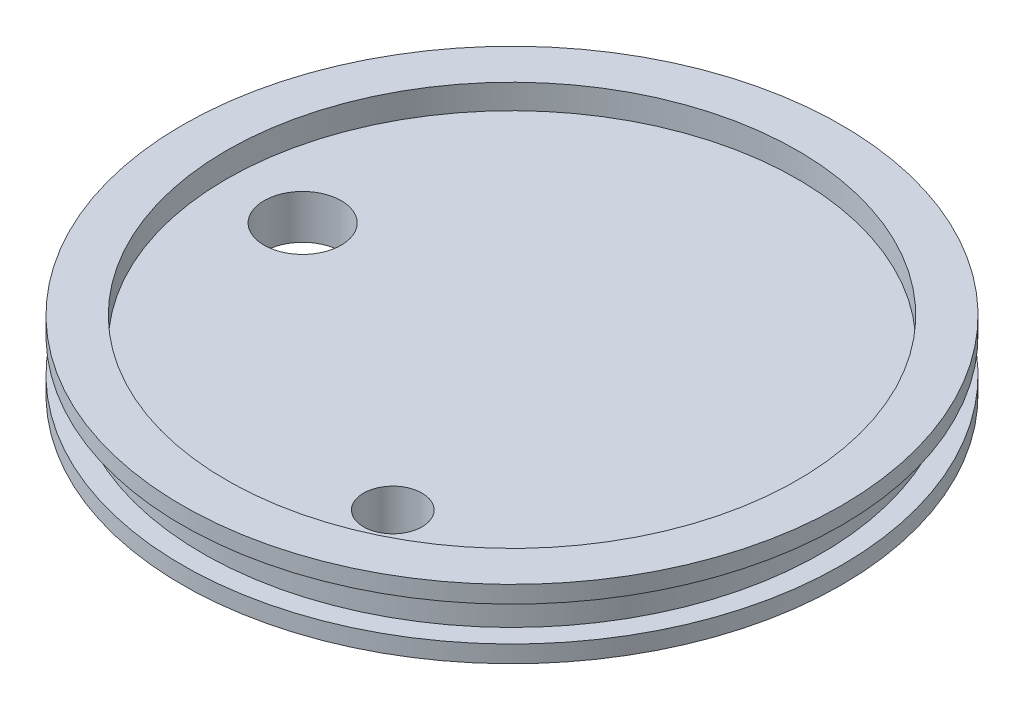
ISO-10303-21;
HEADER;
FILE_DESCRIPTION(('STEP AP214'),'2;1');
FILE_NAME('part.step','',(''),(''),'','','');
FILE_SCHEMA(('AUTOMOTIVE_DESIGN { 1 0 10303 214 1 1 1 1 }'));
ENDSEC;
DATA;
#1=APPLICATION_CONTEXT('core data for automotive mechanical design processes');
#2=APPLICATION_PROTOCOL_DEFINITION('international standard','automotive_design',2000,#1);
#3=PRODUCT_CONTEXT('',#1,'mechanical');
#4=PRODUCT('Part','Part','',(#3));
#5=PRODUCT_RELATED_PRODUCT_CATEGORY('part','',(#4));
#6=PRODUCT_DEFINITION_FORMATION('','',#4);
#7=PRODUCT_DEFINITION_CONTEXT('part definition',#1,'design');
#8=PRODUCT_DEFINITION('design','',#6,#7);
#9=PRODUCT_DEFINITION_SHAPE('','',#8);
#10=(LENGTH_UNIT() NAMED_UNIT(*) SI_UNIT(.MILLI.,.METRE.));
#11=(NAMED_UNIT(*) PLANE_ANGLE_UNIT() SI_UNIT($,.RADIAN.));
#12=(NAMED_UNIT(*) SI_UNIT($,.STERADIAN.) SOLID_ANGLE_UNIT());
#13=UNCERTAINTY_MEASURE_WITH_UNIT(LENGTH_MEASURE(1.E-05),#10,'distance_accuracy_value','');
#14=(GEOMETRIC_REPRESENTATION_CONTEXT(3) GLOBAL_UNCERTAINTY_ASSIGNED_CONTEXT((#13)) GLOBAL_UNIT_ASSIGNED_CONTEXT((#10,
#11,#12)) REPRESENTATION_CONTEXT('',''));
#15=CARTESIAN_POINT('',(0.,0.,0.));
#16=DIRECTION('',(0.,0.,1.));
#17=DIRECTION('',(1.,0.,0.));
#18=AXIS2_PLACEMENT_3D('',#15,#16,#17);
#19=CARTESIAN_POINT('',(0.,0.,0.));
#20=DIRECTION('',(0.,1.,0.));
#21=DIRECTION('',(-1.,0.,0.));
#22=AXIS2_PLACEMENT_3D('',#19,#20,#21);
#23=PLANE('',#22);
#24=CARTESIAN_POINT('',(12.1501989775916,0.,29.3331751572333));
#25=DIRECTION('',(0.,1.,0.));
#26=DIRECTION('',(0.,0.,1.));
#27=AXIS2_PLACEMENT_3D('',#24,#25,#26);
#28=CIRCLE('',#27,4.2164);
#29=CARTESIAN_POINT('',(12.1501989775916,0.,33.5495751572333));
#30=VERTEX_POINT('',#29);
#31=EDGE_CURVE('E74',#30,#30,#28,.T.);
#32=ORIENTED_EDGE('',*,*,#31,.T.);
#33=EDGE_LOOP('',(#32));
#34=FACE_BOUND('',#33,.T.);
#35=CARTESIAN_POINT('',(-30.1752,0.,0.));
#36=DIRECTION('',(0.,1.,0.));
#37=DIRECTION('',(0.,0.,1.));
#38=AXIS2_PLACEMENT_3D('',#35,#36,#37);
#39=CIRCLE('',#38,5.5626);
#40=CARTESIAN_POINT('',(-30.1752,0.,5.5626));
#41=VERTEX_POINT('',#40);
#42=EDGE_CURVE('E68',#41,#41,#39,.T.);
#43=ORIENTED_EDGE('',*,*,#42,.T.);
#44=EDGE_LOOP('',(#43));
#45=FACE_BOUND('',#44,.T.);
#46=CARTESIAN_POINT('',(0.,0.,0.));
#47=DIRECTION('',(0.,1.,0.));
#48=DIRECTION('',(-1.,0.,0.));
#49=AXIS2_PLACEMENT_3D('',#46,#47,#48);
#50=CIRCLE('',#49,47.498);
#51=CARTESIAN_POINT('',(-47.498,0.,0.));
#52=VERTEX_POINT('',#51);
#53=EDGE_CURVE('E10',#52,#52,#50,.T.);
#54=ORIENTED_EDGE('',*,*,#53,.F.);
#55=EDGE_LOOP('',(#54));
#56=FACE_BOUND('',#55,.T.);
#57=ADVANCED_FACE('F37',(#34,#45,#56),#23,.F.);
#58=CARTESIAN_POINT('',(0.,48.1922132313012,0.));
#59=DIRECTION('',(0.,1.,0.));
#60=DIRECTION('',(-1.,0.,0.));
#61=AXIS2_PLACEMENT_3D('',#58,#59,#60);
#62=CYLINDRICAL_SURFACE('',#61,47.498);
#63=CARTESIAN_POINT('',(0.,2.4638,0.));
#64=DIRECTION('',(0.,1.,0.));
#65=DIRECTION('',(-1.,0.,0.));
#66=AXIS2_PLACEMENT_3D('',#63,#64,#65);
#67=CIRCLE('',#66,47.498);
#68=CARTESIAN_POINT('',(-47.498,2.46379999999999,0.));
#69=VERTEX_POINT('',#68);
#70=EDGE_CURVE('E43',#69,#69,#67,.T.);
#71=ORIENTED_EDGE('',*,*,#70,.F.);
#72=EDGE_LOOP('',(#71));
#73=FACE_BOUND('',#72,.T.);
#74=ORIENTED_EDGE('',*,*,#53,.T.);
#75=EDGE_LOOP('',(#74));
#76=FACE_BOUND('',#75,.T.);
#77=ADVANCED_FACE('F124',(#73,#76),#62,.T.);
#78=CARTESIAN_POINT('',(47.498,2.4638,0.));
#79=DIRECTION('',(0.,-1.,0.));
#80=DIRECTION('',(1.,0.,0.));
#81=AXIS2_PLACEMENT_3D('',#78,#79,#80);
#82=PLANE('',#81);
#83=CARTESIAN_POINT('',(0.,2.4638,0.));
#84=DIRECTION('',(0.,1.,0.));
#85=DIRECTION('',(-1.,0.,0.));
#86=AXIS2_PLACEMENT_3D('',#83,#84,#85);
#87=CIRCLE('',#86,44.577);
#88=CARTESIAN_POINT('',(-44.577,2.46379999999999,0.));
#89=VERTEX_POINT('',#88);
#90=EDGE_CURVE('E47',#89,#89,#87,.T.);
#91=ORIENTED_EDGE('',*,*,#90,.F.);
#92=EDGE_LOOP('',(#91));
#93=FACE_BOUND('',#92,.T.);
#94=ORIENTED_EDGE('',*,*,#70,.T.);
#95=EDGE_LOOP('',(#94));
#96=FACE_BOUND('',#95,.T.);
#97=ADVANCED_FACE('F119',(#93,#96),#82,.F.);
#98=CARTESIAN_POINT('',(0.,48.1922132313012,0.));
#99=DIRECTION('',(0.,1.,0.));
#100=DIRECTION('',(-1.,0.,0.));
#101=AXIS2_PLACEMENT_3D('',#98,#99,#100);
#102=CYLINDRICAL_SURFACE('',#101,44.577);
#103=CARTESIAN_POINT('',(0.,7.44219999999999,0.));
#104=DIRECTION('',(0.,1.,0.));
#105=DIRECTION('',(-1.,0.,0.));
#106=AXIS2_PLACEMENT_3D('',#103,#104,#105);
#107=CIRCLE('',#106,44.577);
#108=CARTESIAN_POINT('',(-44.577,7.44219999999998,0.));
#109=VERTEX_POINT('',#108);
#110=EDGE_CURVE('E51',#109,#109,#107,.T.);
#111=ORIENTED_EDGE('',*,*,#110,.F.);
#112=EDGE_LOOP('',(#111));
#113=FACE_BOUND('',#112,.T.);
#114=ORIENTED_EDGE('',*,*,#90,.T.);
#115=EDGE_LOOP('',(#114));
#116=FACE_BOUND('',#115,.T.);
#117=ADVANCED_FACE('F113',(#113,#116),#102,.T.);
#118=CARTESIAN_POINT('',(44.577,7.4422,0.));
#119=DIRECTION('',(0.,1.,0.));
#120=DIRECTION('',(-1.,0.,0.));
#121=AXIS2_PLACEMENT_3D('',#118,#119,#120);
#122=PLANE('',#121);
#123=CARTESIAN_POINT('',(0.,7.44219999999999,0.));
#124=DIRECTION('',(0.,1.,0.));
#125=DIRECTION('',(-1.,0.,0.));
#126=AXIS2_PLACEMENT_3D('',#123,#124,#125);
#127=CIRCLE('',#126,47.498);
#128=CARTESIAN_POINT('',(-47.498,7.44219999999998,0.));
#129=VERTEX_POINT('',#128);
#130=EDGE_CURVE('E56',#129,#129,#127,.T.);
#131=ORIENTED_EDGE('',*,*,#130,.F.);
#132=EDGE_LOOP('',(#131));
#133=FACE_BOUND('',#132,.T.);
#134=ORIENTED_EDGE('',*,*,#110,.T.);
#135=EDGE_LOOP('',(#134));
#136=FACE_BOUND('',#135,.T.);
#137=ADVANCED_FACE('F107',(#133,#136),#122,.F.);
#138=CARTESIAN_POINT('',(0.,48.1922132313012,0.));
#139=DIRECTION('',(0.,1.,0.));
#140=DIRECTION('',(-1.,0.,0.));
#141=AXIS2_PLACEMENT_3D('',#138,#139,#140);
#142=CYLINDRICAL_SURFACE('',#141,47.498);
#143=CARTESIAN_POINT('',(0.,9.90599999999999,0.));
#144=DIRECTION('',(0.,1.,0.));
#145=DIRECTION('',(-1.,0.,0.));
#146=AXIS2_PLACEMENT_3D('',#143,#144,#145);
#147=CIRCLE('',#146,47.498);
#148=CARTESIAN_POINT('',(-47.498,9.90599999999999,0.));
#149=VERTEX_POINT('',#148);
#150=EDGE_CURVE('E59',#149,#149,#147,.T.);
#151=ORIENTED_EDGE('',*,*,#150,.F.);
#152=EDGE_LOOP('',(#151));
#153=FACE_BOUND('',#152,.T.);
#154=ORIENTED_EDGE('',*,*,#130,.T.);
#155=EDGE_LOOP('',(#154));
#156=FACE_BOUND('',#155,.T.);
#157=ADVANCED_FACE('F101',(#153,#156),#142,.T.);
#158=CARTESIAN_POINT('',(47.498,9.906,0.));
#159=DIRECTION('',(0.,-1.,0.));
#160=DIRECTION('',(1.,0.,0.));
#161=AXIS2_PLACEMENT_3D('',#158,#159,#160);
#162=PLANE('',#161);
#163=CARTESIAN_POINT('',(0.,9.90599999999999,0.));
#164=DIRECTION('',(0.,1.,0.));
#165=DIRECTION('',(-1.,0.,0.));
#166=AXIS2_PLACEMENT_3D('',#163,#164,#165);
#167=CIRCLE('',#166,41.148);
#168=CARTESIAN_POINT('',(-41.148,9.90599999999999,0.));
#169=VERTEX_POINT('',#168);
#170=EDGE_CURVE('E62',#169,#169,#167,.T.);
#171=ORIENTED_EDGE('',*,*,#170,.F.);
#172=EDGE_LOOP('',(#171));
#173=FACE_BOUND('',#172,.T.);
#174=ORIENTED_EDGE('',*,*,#150,.T.);
#175=EDGE_LOOP('',(#174));
#176=FACE_BOUND('',#175,.T.);
#177=ADVANCED_FACE('F95',(#173,#176),#162,.F.);
#178=CARTESIAN_POINT('',(0.,48.1922132313012,0.));
#179=DIRECTION('',(0.,1.,0.));
#180=DIRECTION('',(-1.,0.,0.));
#181=AXIS2_PLACEMENT_3D('',#178,#179,#180);
#182=CYLINDRICAL_SURFACE('',#181,41.148);
#183=CARTESIAN_POINT('',(0.,6.34999999999999,0.));
#184=DIRECTION('',(0.,1.,0.));
#185=DIRECTION('',(-1.,0.,0.));
#186=AXIS2_PLACEMENT_3D('',#183,#184,#185);
#187=CIRCLE('',#186,41.148);
#188=CARTESIAN_POINT('',(-41.148,6.34999999999999,0.));
#189=VERTEX_POINT('',#188);
#190=EDGE_CURVE('E65',#189,#189,#187,.T.);
#191=ORIENTED_EDGE('',*,*,#190,.F.);
#192=EDGE_LOOP('',(#191));
#193=FACE_BOUND('',#192,.T.);
#194=ORIENTED_EDGE('',*,*,#170,.T.);
#195=EDGE_LOOP('',(#194));
#196=FACE_BOUND('',#195,.T.);
#197=ADVANCED_FACE('F87',(#193,#196),#182,.F.);
#198=CARTESIAN_POINT('',(41.148,6.35,0.));
#199=DIRECTION('',(0.,-1.,0.));
#200=DIRECTION('',(1.,0.,0.));
#201=AXIS2_PLACEMENT_3D('',#198,#199,#200);
#202=PLANE('',#201);
#203=CARTESIAN_POINT('',(12.1501989775916,6.35,29.3331751572333));
#204=DIRECTION('',(0.,1.,0.));
#205=DIRECTION('',(0.,0.,1.));
#206=AXIS2_PLACEMENT_3D('',#203,#204,#205);
#207=CIRCLE('',#206,4.2164);
#208=CARTESIAN_POINT('',(12.1501989775916,6.35,33.5495751572333));
#209=VERTEX_POINT('',#208);
#210=EDGE_CURVE('E77',#209,#209,#207,.T.);
#211=ORIENTED_EDGE('',*,*,#210,.F.);
#212=EDGE_LOOP('',(#211));
#213=FACE_BOUND('',#212,.T.);
#214=CARTESIAN_POINT('',(-30.1752,6.34999999999999,0.));
#215=DIRECTION('',(0.,1.,0.));
#216=DIRECTION('',(0.,0.,1.));
#217=AXIS2_PLACEMENT_3D('',#214,#215,#216);
#218=CIRCLE('',#217,5.56259999999999);
#219=CARTESIAN_POINT('',(-30.1752,6.34999999999999,5.56259999999999));
#220=VERTEX_POINT('',#219);
#221=EDGE_CURVE('E71',#220,#220,#218,.T.);
#222=ORIENTED_EDGE('',*,*,#221,.F.);
#223=EDGE_LOOP('',(#222));
#224=FACE_BOUND('',#223,.T.);
#225=ORIENTED_EDGE('',*,*,#190,.T.);
#226=EDGE_LOOP('',(#225));
#227=FACE_BOUND('',#226,.T.);
#228=ADVANCED_FACE('F83',(#213,#224,#227),#202,.F.);
#229=CARTESIAN_POINT('',(-30.1752,6.34999999999999,0.));
#230=DIRECTION('',(0.,1.,0.));
#231=DIRECTION('',(0.,0.,1.));
#232=AXIS2_PLACEMENT_3D('',#229,#230,#231);
#233=CYLINDRICAL_SURFACE('',#232,5.56259999999999);
#234=ORIENTED_EDGE('',*,*,#42,.F.);
#235=EDGE_LOOP('',(#234));
#236=FACE_BOUND('',#235,.T.);
#237=ORIENTED_EDGE('',*,*,#221,.T.);
#238=EDGE_LOOP('',(#237));
#239=FACE_BOUND('',#238,.T.);
#240=ADVANCED_FACE('F86',(#236,#239),#233,.F.);
#241=CARTESIAN_POINT('',(12.1501989775916,6.35,29.3331751572333));
#242=DIRECTION('',(0.,1.,0.));
#243=DIRECTION('',(0.,0.,1.));
#244=AXIS2_PLACEMENT_3D('',#241,#242,#243);
#245=CYLINDRICAL_SURFACE('',#244,4.2164);
#246=ORIENTED_EDGE('',*,*,#31,.F.);
#247=EDGE_LOOP('',(#246));
#248=FACE_BOUND('',#247,.T.);
#249=ORIENTED_EDGE('',*,*,#210,.T.);
#250=EDGE_LOOP('',(#249));
#251=FACE_BOUND('',#250,.T.);
#252=ADVANCED_FACE('F81',(#248,#251),#245,.F.);
#253=CLOSED_SHELL('',(#57,#77,#97,#117,#137,#157,#177,#197,#228,#240,#252));
#254=MANIFOLD_SOLID_BREP('B2',#253);
#255=ADVANCED_BREP_SHAPE_REPRESENTATION('',(#18,#254),#14);
#256=SHAPE_DEFINITION_REPRESENTATION(#9,#255);
ENDSEC;
END-ISO-10303-21;
